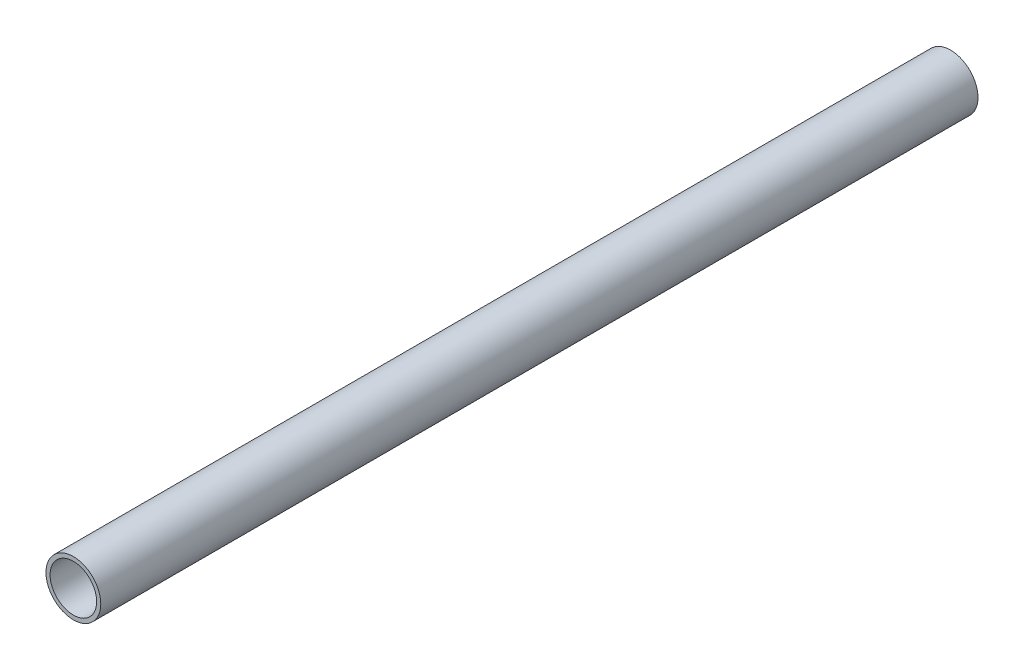
ISO-10303-21;
HEADER;
FILE_DESCRIPTION(('STEP AP214'),'2;1');
FILE_NAME('part.step','',(''),(''),'','','');
FILE_SCHEMA(('AUTOMOTIVE_DESIGN { 1 0 10303 214 1 1 1 1 }'));
ENDSEC;
DATA;
#1=APPLICATION_CONTEXT('core data for automotive mechanical design processes');
#2=APPLICATION_PROTOCOL_DEFINITION('international standard','automotive_design',2000,#1);
#3=PRODUCT_CONTEXT('',#1,'mechanical');
#4=PRODUCT('Part','Part','',(#3));
#5=PRODUCT_RELATED_PRODUCT_CATEGORY('part','',(#4));
#6=PRODUCT_DEFINITION_FORMATION('','',#4);
#7=PRODUCT_DEFINITION_CONTEXT('part definition',#1,'design');
#8=PRODUCT_DEFINITION('design','',#6,#7);
#9=PRODUCT_DEFINITION_SHAPE('','',#8);
#10=(LENGTH_UNIT() NAMED_UNIT(*) SI_UNIT(.MILLI.,.METRE.));
#11=(NAMED_UNIT(*) PLANE_ANGLE_UNIT() SI_UNIT($,.RADIAN.));
#12=(NAMED_UNIT(*) SI_UNIT($,.STERADIAN.) SOLID_ANGLE_UNIT());
#13=UNCERTAINTY_MEASURE_WITH_UNIT(LENGTH_MEASURE(1.E-05),#10,'distance_accuracy_value','');
#14=(GEOMETRIC_REPRESENTATION_CONTEXT(3) GLOBAL_UNCERTAINTY_ASSIGNED_CONTEXT((#13)) GLOBAL_UNIT_ASSIGNED_CONTEXT((#10,
#11,#12)) REPRESENTATION_CONTEXT('',''));
#15=CARTESIAN_POINT('',(0.,0.,0.));
#16=DIRECTION('',(0.,0.,1.));
#17=DIRECTION('',(1.,0.,0.));
#18=AXIS2_PLACEMENT_3D('',#15,#16,#17);
#19=CARTESIAN_POINT('',(0.,0.,320.));
#20=DIRECTION('',(0.,0.,1.));
#21=DIRECTION('',(1.,0.,0.));
#22=AXIS2_PLACEMENT_3D('',#19,#20,#21);
#23=PLANE('',#22);
#24=CARTESIAN_POINT('',(0.,0.,320.));
#25=DIRECTION('',(0.,0.,1.));
#26=DIRECTION('',(1.,0.,0.));
#27=AXIS2_PLACEMENT_3D('',#24,#25,#26);
#28=CIRCLE('',#27,10.);
#29=CARTESIAN_POINT('',(10.,0.,320.));
#30=VERTEX_POINT('',#29);
#31=EDGE_CURVE('E10',#30,#30,#28,.T.);
#32=ORIENTED_EDGE('',*,*,#31,.T.);
#33=EDGE_LOOP('',(#32));
#34=FACE_BOUND('',#33,.T.);
#35=CARTESIAN_POINT('',(0.,0.,320.));
#36=DIRECTION('',(0.,0.,1.));
#37=DIRECTION('',(1.,0.,0.));
#38=AXIS2_PLACEMENT_3D('',#35,#36,#37);
#39=CIRCLE('',#38,8.5);
#40=CARTESIAN_POINT('',(8.5,0.,320.));
#41=VERTEX_POINT('',#40);
#42=EDGE_CURVE('E42',#41,#41,#39,.T.);
#43=ORIENTED_EDGE('',*,*,#42,.F.);
#44=EDGE_LOOP('',(#43));
#45=FACE_BOUND('',#44,.T.);
#46=ADVANCED_FACE('F31',(#34,#45),#23,.T.);
#47=CARTESIAN_POINT('',(0.,0.,0.));
#48=DIRECTION('',(0.,0.,1.));
#49=DIRECTION('',(1.,0.,0.));
#50=AXIS2_PLACEMENT_3D('',#47,#48,#49);
#51=PLANE('',#50);
#52=CARTESIAN_POINT('',(0.,0.,0.));
#53=DIRECTION('',(0.,0.,1.));
#54=DIRECTION('',(1.,0.,0.));
#55=AXIS2_PLACEMENT_3D('',#52,#53,#54);
#56=CIRCLE('',#55,10.);
#57=CARTESIAN_POINT('',(10.,0.,0.));
#58=VERTEX_POINT('',#57);
#59=EDGE_CURVE('E35',#58,#58,#56,.T.);
#60=ORIENTED_EDGE('',*,*,#59,.F.);
#61=EDGE_LOOP('',(#60));
#62=FACE_BOUND('',#61,.T.);
#63=CARTESIAN_POINT('',(0.,0.,0.));
#64=DIRECTION('',(0.,0.,1.));
#65=DIRECTION('',(1.,0.,0.));
#66=AXIS2_PLACEMENT_3D('',#63,#64,#65);
#67=CIRCLE('',#66,8.5);
#68=CARTESIAN_POINT('',(8.5,0.,0.));
#69=VERTEX_POINT('',#68);
#70=EDGE_CURVE('E44',#69,#69,#67,.T.);
#71=ORIENTED_EDGE('',*,*,#70,.T.);
#72=EDGE_LOOP('',(#71));
#73=FACE_BOUND('',#72,.T.);
#74=ADVANCED_FACE('F54',(#62,#73),#51,.F.);
#75=CARTESIAN_POINT('',(0.,0.,320.));
#76=DIRECTION('',(0.,0.,-1.));
#77=DIRECTION('',(-1.,0.,0.));
#78=AXIS2_PLACEMENT_3D('',#75,#76,#77);
#79=CYLINDRICAL_SURFACE('',#78,10.);
#80=ORIENTED_EDGE('',*,*,#31,.F.);
#81=EDGE_LOOP('',(#80));
#82=FACE_BOUND('',#81,.T.);
#83=ORIENTED_EDGE('',*,*,#59,.T.);
#84=EDGE_LOOP('',(#83));
#85=FACE_BOUND('',#84,.T.);
#86=ADVANCED_FACE('F33',(#82,#85),#79,.T.);
#87=CARTESIAN_POINT('',(0.,0.,320.));
#88=DIRECTION('',(0.,0.,-1.));
#89=DIRECTION('',(-1.,0.,0.));
#90=AXIS2_PLACEMENT_3D('',#87,#88,#89);
#91=CYLINDRICAL_SURFACE('',#90,8.5);
#92=ORIENTED_EDGE('',*,*,#42,.T.);
#93=EDGE_LOOP('',(#92));
#94=FACE_BOUND('',#93,.T.);
#95=ORIENTED_EDGE('',*,*,#70,.F.);
#96=EDGE_LOOP('',(#95));
#97=FACE_BOUND('',#96,.T.);
#98=ADVANCED_FACE('F50',(#94,#97),#91,.F.);
#99=CLOSED_SHELL('',(#46,#74,#86,#98));
#100=MANIFOLD_SOLID_BREP('B2',#99);
#101=ADVANCED_BREP_SHAPE_REPRESENTATION('',(#18,#100),#14);
#102=SHAPE_DEFINITION_REPRESENTATION(#9,#101);
ENDSEC;
END-ISO-10303-21;
